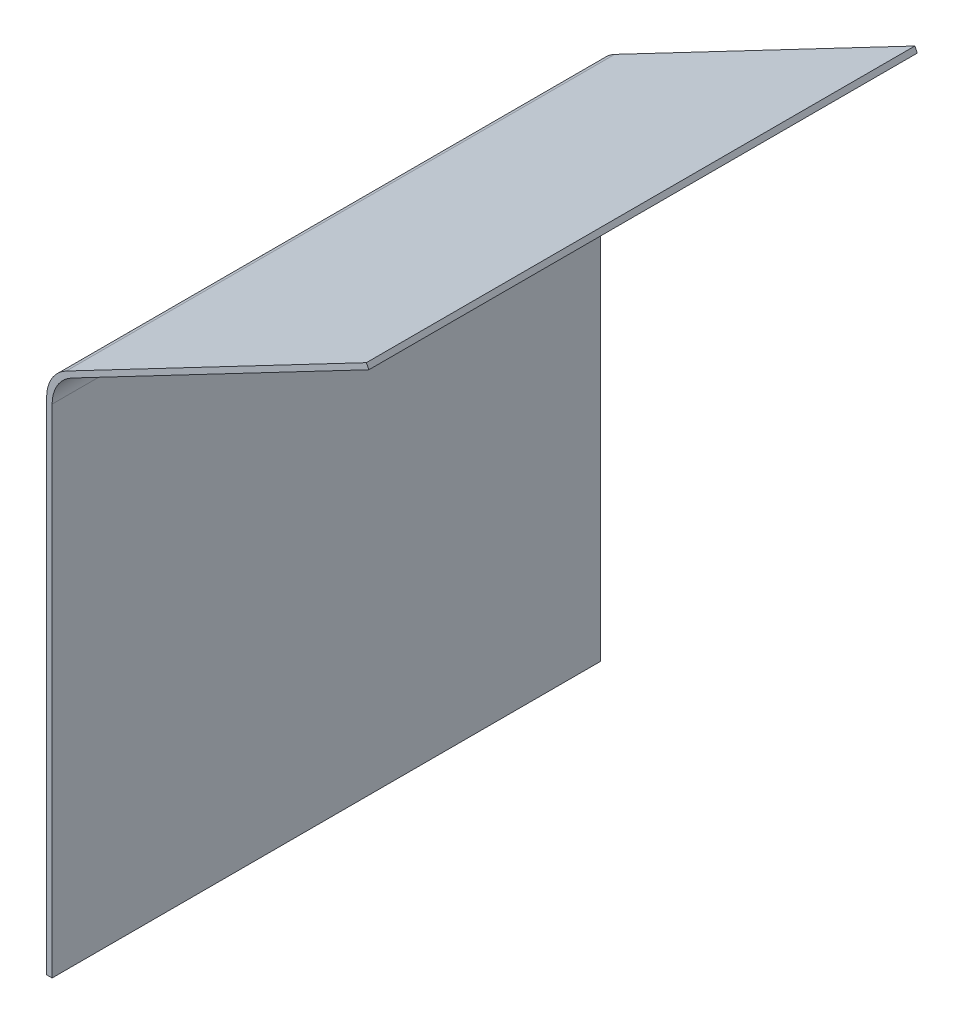
ISO-10303-21;
HEADER;
FILE_DESCRIPTION(('STEP AP214'),'2;1');
FILE_NAME('part.step','',(''),(''),'','','');
FILE_SCHEMA(('AUTOMOTIVE_DESIGN { 1 0 10303 214 1 1 1 1 }'));
ENDSEC;
DATA;
#1=APPLICATION_CONTEXT('core data for automotive mechanical design processes');
#2=APPLICATION_PROTOCOL_DEFINITION('international standard','automotive_design',2000,#1);
#3=PRODUCT_CONTEXT('',#1,'mechanical');
#4=PRODUCT('Part','Part','',(#3));
#5=PRODUCT_RELATED_PRODUCT_CATEGORY('part','',(#4));
#6=PRODUCT_DEFINITION_FORMATION('','',#4);
#7=PRODUCT_DEFINITION_CONTEXT('part definition',#1,'design');
#8=PRODUCT_DEFINITION('design','',#6,#7);
#9=PRODUCT_DEFINITION_SHAPE('','',#8);
#10=(LENGTH_UNIT() NAMED_UNIT(*) SI_UNIT(.MILLI.,.METRE.));
#11=(NAMED_UNIT(*) PLANE_ANGLE_UNIT() SI_UNIT($,.RADIAN.));
#12=(NAMED_UNIT(*) SI_UNIT($,.STERADIAN.) SOLID_ANGLE_UNIT());
#13=UNCERTAINTY_MEASURE_WITH_UNIT(LENGTH_MEASURE(1.E-05),#10,'distance_accuracy_value','');
#14=(GEOMETRIC_REPRESENTATION_CONTEXT(3) GLOBAL_UNCERTAINTY_ASSIGNED_CONTEXT((#13)) GLOBAL_UNIT_ASSIGNED_CONTEXT((#10,
#11,#12)) REPRESENTATION_CONTEXT('',''));
#15=CARTESIAN_POINT('',(0.,0.,0.));
#16=DIRECTION('',(0.,0.,1.));
#17=DIRECTION('',(1.,0.,0.));
#18=AXIS2_PLACEMENT_3D('',#15,#16,#17);
#19=CARTESIAN_POINT('',(-18.3709300936599,35.0485280725317,-20.));
#20=DIRECTION('',(-0.464248452543096,0.885705015403741,0.));
#21=DIRECTION('',(-0.885705015403741,-0.464248452543096,0.));
#22=AXIS2_PLACEMENT_3D('',#19,#20,#21);
#23=PLANE('',#22);
#24=DIRECTION('',(0.,0.,1.));
#25=VECTOR('',#24,1.);
#26=CARTESIAN_POINT('',(-160.920969050862,-39.6700676731094,-20.));
#27=LINE('',#26,#25);
#28=CARTESIAN_POINT('',(-160.920969050862,-39.6700676731094,-20.));
#29=VERTEX_POINT('',#28);
#30=CARTESIAN_POINT('',(-160.920969050862,-39.6700676731094,280.));
#31=VERTEX_POINT('',#30);
#32=EDGE_CURVE('E38',#29,#31,#27,.T.);
#33=ORIENTED_EDGE('',*,*,#32,.T.);
#34=DIRECTION('',(-0.885705015403741,-0.464248452543096,0.));
#35=VECTOR('',#34,1.);
#36=CARTESIAN_POINT('',(-18.3709300936599,35.0485280725317,280.));
#37=LINE('',#36,#35);
#38=CARTESIAN_POINT('',(3.2407471375428,46.376439213323,280.));
#39=VERTEX_POINT('',#38);
#40=EDGE_CURVE('E99',#39,#31,#37,.T.);
#41=ORIENTED_EDGE('',*,*,#40,.F.);
#42=DIRECTION('',(0.,0.,1.));
#43=VECTOR('',#42,1.);
#44=CARTESIAN_POINT('',(3.2407471375428,46.376439213323,-20.));
#45=LINE('',#44,#43);
#46=CARTESIAN_POINT('',(3.2407471375428,46.376439213323,-20.));
#47=VERTEX_POINT('',#46);
#48=EDGE_CURVE('E11',#47,#39,#45,.T.);
#49=ORIENTED_EDGE('',*,*,#48,.F.);
#50=DIRECTION('',(-0.885705015403741,-0.464248452543096,0.));
#51=VECTOR('',#50,1.);
#52=CARTESIAN_POINT('',(-18.3709300936599,35.0485280725317,-20.));
#53=LINE('',#52,#51);
#54=EDGE_CURVE('E101',#47,#29,#53,.T.);
#55=ORIENTED_EDGE('',*,*,#54,.T.);
#56=EDGE_LOOP('',(#33,#41,#49,#55));
#57=FACE_BOUND('',#56,.T.);
#58=ADVANCED_FACE('F35',(#57),#23,.T.);
#59=CARTESIAN_POINT('',(21.6116772312027,11.3279111407913,-20.));
#60=DIRECTION('',(-0.885705015403741,-0.464248452543096,0.));
#61=DIRECTION('',(0.464248452543096,-0.885705015403741,0.));
#62=AXIS2_PLACEMENT_3D('',#59,#60,#61);
#63=PLANE('',#62);
#64=ORIENTED_EDGE('',*,*,#48,.T.);
#65=DIRECTION('',(0.464248452543096,-0.885705015403741,0.));
#66=VECTOR('',#65,1.);
#67=CARTESIAN_POINT('',(21.6116772312027,11.3279111407913,280.));
#68=LINE('',#67,#66);
#69=CARTESIAN_POINT('',(4.63349249517208,43.7193241671118,280.));
#70=VERTEX_POINT('',#69);
#71=EDGE_CURVE('E118',#39,#70,#68,.T.);
#72=ORIENTED_EDGE('',*,*,#71,.T.);
#73=DIRECTION('',(0.,0.,1.));
#74=VECTOR('',#73,1.);
#75=CARTESIAN_POINT('',(4.63349249517208,43.7193241671118,-20.));
#76=LINE('',#75,#74);
#77=CARTESIAN_POINT('',(4.63349249517208,43.7193241671118,-20.));
#78=VERTEX_POINT('',#77);
#79=EDGE_CURVE('E43',#78,#70,#76,.T.);
#80=ORIENTED_EDGE('',*,*,#79,.F.);
#81=DIRECTION('',(0.464248452543096,-0.885705015403741,0.));
#82=VECTOR('',#81,1.);
#83=CARTESIAN_POINT('',(21.6116772312027,11.3279111407913,-20.));
#84=LINE('',#83,#82);
#85=EDGE_CURVE('E56',#47,#78,#84,.T.);
#86=ORIENTED_EDGE('',*,*,#85,.F.);
#87=EDGE_LOOP('',(#64,#72,#80,#86));
#88=FACE_BOUND('',#87,.T.);
#89=ADVANCED_FACE('F180',(#88),#63,.F.);
#90=CARTESIAN_POINT('',(-16.9781847360306,32.3914130263205,-20.));
#91=DIRECTION('',(-0.464248452543096,0.885705015403741,0.));
#92=DIRECTION('',(-0.885705015403741,-0.464248452543096,0.));
#93=AXIS2_PLACEMENT_3D('',#90,#91,#92);
#94=PLANE('',#93);
#95=ORIENTED_EDGE('',*,*,#79,.T.);
#96=DIRECTION('',(-0.885705015403741,-0.464248452543096,0.));
#97=VECTOR('',#96,1.);
#98=CARTESIAN_POINT('',(-16.9781847360306,32.3914130263205,280.));
#99=LINE('',#98,#97);
#100=CARTESIAN_POINT('',(-157.920969050862,-41.4847290043857,280.));
#101=VERTEX_POINT('',#100);
#102=EDGE_CURVE('E131',#70,#101,#99,.T.);
#103=ORIENTED_EDGE('',*,*,#102,.T.);
#104=DIRECTION('',(0.,0.,1.));
#105=VECTOR('',#104,1.);
#106=CARTESIAN_POINT('',(-157.920969050862,-41.4847290043857,-20.));
#107=LINE('',#106,#105);
#108=CARTESIAN_POINT('',(-157.920969050862,-41.4847290043857,-20.));
#109=VERTEX_POINT('',#108);
#110=EDGE_CURVE('E152',#109,#101,#107,.T.);
#111=ORIENTED_EDGE('',*,*,#110,.F.);
#112=DIRECTION('',(-0.885705015403741,-0.464248452543096,0.));
#113=VECTOR('',#112,1.);
#114=CARTESIAN_POINT('',(-16.9781847360306,32.3914130263205,-20.));
#115=LINE('',#114,#113);
#116=EDGE_CURVE('E148',#78,#109,#115,.T.);
#117=ORIENTED_EDGE('',*,*,#116,.F.);
#118=EDGE_LOOP('',(#95,#103,#111,#117));
#119=FACE_BOUND('',#118,.T.);
#120=ADVANCED_FACE('F177',(#119),#94,.F.);
#121=CARTESIAN_POINT('',(-148.636,-59.1988293124606,-20.));
#122=DIRECTION('',(0.,0.,1.));
#123=DIRECTION('',(1.,0.,0.));
#124=AXIS2_PLACEMENT_3D('',#121,#122,#123);
#125=CYLINDRICAL_SURFACE('',#124,20.);
#126=ORIENTED_EDGE('',*,*,#110,.T.);
#127=CARTESIAN_POINT('',(-148.636,-59.1988293124606,280.));
#128=DIRECTION('',(0.,0.,1.));
#129=DIRECTION('',(1.,0.,0.));
#130=AXIS2_PLACEMENT_3D('',#127,#128,#129);
#131=CIRCLE('',#130,20.);
#132=CARTESIAN_POINT('',(-168.636,-59.1988293124606,280.));
#133=VERTEX_POINT('',#132);
#134=EDGE_CURVE('E128',#101,#133,#131,.T.);
#135=ORIENTED_EDGE('',*,*,#134,.T.);
#136=DIRECTION('',(0.,0.,1.));
#137=VECTOR('',#136,1.);
#138=CARTESIAN_POINT('',(-168.636,-59.1988293124606,-20.));
#139=LINE('',#138,#137);
#140=CARTESIAN_POINT('',(-168.636,-59.1988293124606,-20.));
#141=VERTEX_POINT('',#140);
#142=EDGE_CURVE('E154',#141,#133,#139,.T.);
#143=ORIENTED_EDGE('',*,*,#142,.F.);
#144=CARTESIAN_POINT('',(-148.636,-59.1988293124606,-20.));
#145=DIRECTION('',(0.,0.,1.));
#146=DIRECTION('',(1.,0.,0.));
#147=AXIS2_PLACEMENT_3D('',#144,#145,#146);
#148=CIRCLE('',#147,20.);
#149=EDGE_CURVE('E146',#109,#141,#148,.T.);
#150=ORIENTED_EDGE('',*,*,#149,.F.);
#151=EDGE_LOOP('',(#126,#135,#143,#150));
#152=FACE_BOUND('',#151,.T.);
#153=ADVANCED_FACE('F174',(#152),#125,.F.);
#154=CARTESIAN_POINT('',(-168.636,0.,-20.));
#155=DIRECTION('',(1.,0.,0.));
#156=DIRECTION('',(0.,1.,0.));
#157=AXIS2_PLACEMENT_3D('',#154,#155,#156);
#158=PLANE('',#157);
#159=ORIENTED_EDGE('',*,*,#142,.T.);
#160=DIRECTION('',(0.,1.,0.));
#161=VECTOR('',#160,1.);
#162=CARTESIAN_POINT('',(-168.636,0.,280.));
#163=LINE('',#162,#161);
#164=CARTESIAN_POINT('',(-168.636,-331.050000000052,280.));
#165=VERTEX_POINT('',#164);
#166=EDGE_CURVE('E125',#165,#133,#163,.T.);
#167=ORIENTED_EDGE('',*,*,#166,.F.);
#168=DIRECTION('',(0.,0.,1.));
#169=VECTOR('',#168,1.);
#170=CARTESIAN_POINT('',(-168.636,-331.050000000052,-20.));
#171=LINE('',#170,#169);
#172=CARTESIAN_POINT('',(-168.636,-331.050000000052,-20.));
#173=VERTEX_POINT('',#172);
#174=EDGE_CURVE('E156',#173,#165,#171,.T.);
#175=ORIENTED_EDGE('',*,*,#174,.F.);
#176=DIRECTION('',(0.,1.,0.));
#177=VECTOR('',#176,1.);
#178=CARTESIAN_POINT('',(-168.636,0.,-20.));
#179=LINE('',#178,#177);
#180=EDGE_CURVE('E143',#173,#141,#179,.T.);
#181=ORIENTED_EDGE('',*,*,#180,.T.);
#182=EDGE_LOOP('',(#159,#167,#175,#181));
#183=FACE_BOUND('',#182,.T.);
#184=ADVANCED_FACE('F169',(#183),#158,.T.);
#185=CARTESIAN_POINT('',(0.,-331.050000000052,-20.));
#186=DIRECTION('',(0.,-1.,0.));
#187=DIRECTION('',(0.,0.,-1.));
#188=AXIS2_PLACEMENT_3D('',#185,#186,#187);
#189=PLANE('',#188);
#190=ORIENTED_EDGE('',*,*,#174,.T.);
#191=DIRECTION('',(1.,0.,0.));
#192=VECTOR('',#191,1.);
#193=CARTESIAN_POINT('',(0.,-331.050000000052,280.));
#194=LINE('',#193,#192);
#195=CARTESIAN_POINT('',(-171.636,-331.050000000052,280.));
#196=VERTEX_POINT('',#195);
#197=EDGE_CURVE('E122',#196,#165,#194,.T.);
#198=ORIENTED_EDGE('',*,*,#197,.F.);
#199=DIRECTION('',(0.,0.,1.));
#200=VECTOR('',#199,1.);
#201=CARTESIAN_POINT('',(-171.636,-331.050000000052,-20.));
#202=LINE('',#201,#200);
#203=CARTESIAN_POINT('',(-171.636,-331.050000000052,-20.));
#204=VERTEX_POINT('',#203);
#205=EDGE_CURVE('E158',#204,#196,#202,.T.);
#206=ORIENTED_EDGE('',*,*,#205,.F.);
#207=DIRECTION('',(1.,0.,0.));
#208=VECTOR('',#207,1.);
#209=CARTESIAN_POINT('',(0.,-331.050000000052,-20.));
#210=LINE('',#209,#208);
#211=EDGE_CURVE('E140',#204,#173,#210,.T.);
#212=ORIENTED_EDGE('',*,*,#211,.T.);
#213=EDGE_LOOP('',(#190,#198,#206,#212));
#214=FACE_BOUND('',#213,.T.);
#215=ADVANCED_FACE('F165',(#214),#189,.T.);
#216=CARTESIAN_POINT('',(-171.636,0.,-20.));
#217=DIRECTION('',(1.,0.,0.));
#218=DIRECTION('',(0.,0.,-1.));
#219=AXIS2_PLACEMENT_3D('',#216,#217,#218);
#220=PLANE('',#219);
#221=ORIENTED_EDGE('',*,*,#205,.T.);
#222=DIRECTION('',(0.,1.,0.));
#223=VECTOR('',#222,1.);
#224=CARTESIAN_POINT('',(-171.636,0.,280.));
#225=LINE('',#224,#223);
#226=CARTESIAN_POINT('',(-171.636,-57.3841679811843,280.));
#227=VERTEX_POINT('',#226);
#228=EDGE_CURVE('E113',#196,#227,#225,.T.);
#229=ORIENTED_EDGE('',*,*,#228,.T.);
#230=DIRECTION('',(0.,0.,1.));
#231=VECTOR('',#230,1.);
#232=CARTESIAN_POINT('',(-171.636,-57.3841679811843,-20.));
#233=LINE('',#232,#231);
#234=CARTESIAN_POINT('',(-171.636,-57.3841679811843,-20.));
#235=VERTEX_POINT('',#234);
#236=EDGE_CURVE('E105',#235,#227,#233,.T.);
#237=ORIENTED_EDGE('',*,*,#236,.F.);
#238=DIRECTION('',(0.,1.,0.));
#239=VECTOR('',#238,1.);
#240=CARTESIAN_POINT('',(-171.636,0.,-20.));
#241=LINE('',#240,#239);
#242=EDGE_CURVE('E138',#204,#235,#241,.T.);
#243=ORIENTED_EDGE('',*,*,#242,.F.);
#244=EDGE_LOOP('',(#221,#229,#237,#243));
#245=FACE_BOUND('',#244,.T.);
#246=ADVANCED_FACE('F162',(#245),#220,.F.);
#247=CARTESIAN_POINT('',(-151.636,-57.3841679811842,-20.));
#248=DIRECTION('',(0.,0.,1.));
#249=DIRECTION('',(1.,0.,0.));
#250=AXIS2_PLACEMENT_3D('',#247,#248,#249);
#251=CYLINDRICAL_SURFACE('',#250,20.);
#252=ORIENTED_EDGE('',*,*,#236,.T.);
#253=CARTESIAN_POINT('',(-151.636,-57.3841679811842,280.));
#254=DIRECTION('',(0.,0.,1.));
#255=DIRECTION('',(1.,0.,0.));
#256=AXIS2_PLACEMENT_3D('',#253,#254,#255);
#257=CIRCLE('',#256,20.);
#258=EDGE_CURVE('E107',#31,#227,#257,.T.);
#259=ORIENTED_EDGE('',*,*,#258,.F.);
#260=ORIENTED_EDGE('',*,*,#32,.F.);
#261=CARTESIAN_POINT('',(-151.636,-57.3841679811842,-20.));
#262=DIRECTION('',(0.,0.,1.));
#263=DIRECTION('',(1.,0.,0.));
#264=AXIS2_PLACEMENT_3D('',#261,#262,#263);
#265=CIRCLE('',#264,20.);
#266=EDGE_CURVE('E136',#29,#235,#265,.T.);
#267=ORIENTED_EDGE('',*,*,#266,.T.);
#268=EDGE_LOOP('',(#252,#259,#260,#267));
#269=FACE_BOUND('',#268,.T.);
#270=ADVANCED_FACE('F108',(#269),#251,.T.);
#271=CARTESIAN_POINT('',(0.,0.,-20.));
#272=DIRECTION('',(0.,0.,1.));
#273=DIRECTION('',(1.,0.,0.));
#274=AXIS2_PLACEMENT_3D('',#271,#272,#273);
#275=PLANE('',#274);
#276=ORIENTED_EDGE('',*,*,#54,.F.);
#277=ORIENTED_EDGE('',*,*,#85,.T.);
#278=ORIENTED_EDGE('',*,*,#116,.T.);
#279=ORIENTED_EDGE('',*,*,#149,.T.);
#280=ORIENTED_EDGE('',*,*,#180,.F.);
#281=ORIENTED_EDGE('',*,*,#211,.F.);
#282=ORIENTED_EDGE('',*,*,#242,.T.);
#283=ORIENTED_EDGE('',*,*,#266,.F.);
#284=EDGE_LOOP('',(#276,#277,#278,#279,#280,#281,#282,#283));
#285=FACE_BOUND('',#284,.T.);
#286=ADVANCED_FACE('F181',(#285),#275,.F.);
#287=CARTESIAN_POINT('',(0.,0.,280.));
#288=DIRECTION('',(0.,0.,1.));
#289=DIRECTION('',(1.,0.,0.));
#290=AXIS2_PLACEMENT_3D('',#287,#288,#289);
#291=PLANE('',#290);
#292=ORIENTED_EDGE('',*,*,#40,.T.);
#293=ORIENTED_EDGE('',*,*,#258,.T.);
#294=ORIENTED_EDGE('',*,*,#228,.F.);
#295=ORIENTED_EDGE('',*,*,#197,.T.);
#296=ORIENTED_EDGE('',*,*,#166,.T.);
#297=ORIENTED_EDGE('',*,*,#134,.F.);
#298=ORIENTED_EDGE('',*,*,#102,.F.);
#299=ORIENTED_EDGE('',*,*,#71,.F.);
#300=EDGE_LOOP('',(#292,#293,#294,#295,#296,#297,#298,#299));
#301=FACE_BOUND('',#300,.T.);
#302=ADVANCED_FACE('F115',(#301),#291,.T.);
#303=CLOSED_SHELL('',(#58,#89,#120,#153,#184,#215,#246,#270,#286,#302));
#304=MANIFOLD_SOLID_BREP('B2',#303);
#305=ADVANCED_BREP_SHAPE_REPRESENTATION('',(#18,#304),#14);
#306=SHAPE_DEFINITION_REPRESENTATION(#9,#305);
ENDSEC;
END-ISO-10303-21;
